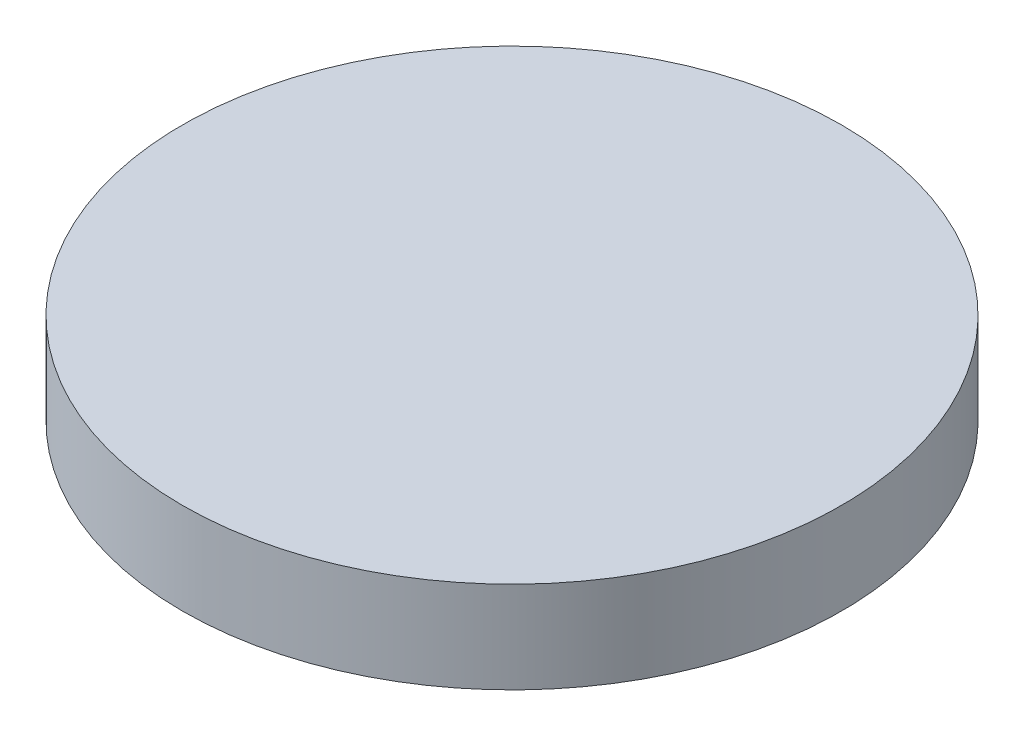
ISO-10303-21;
HEADER;
FILE_DESCRIPTION(('STEP AP214'),'2;1');
FILE_NAME('part.step','',(''),(''),'','','');
FILE_SCHEMA(('AUTOMOTIVE_DESIGN { 1 0 10303 214 1 1 1 1 }'));
ENDSEC;
DATA;
#1=APPLICATION_CONTEXT('core data for automotive mechanical design processes');
#2=APPLICATION_PROTOCOL_DEFINITION('international standard','automotive_design',2000,#1);
#3=PRODUCT_CONTEXT('',#1,'mechanical');
#4=PRODUCT('Part','Part','',(#3));
#5=PRODUCT_RELATED_PRODUCT_CATEGORY('part','',(#4));
#6=PRODUCT_DEFINITION_FORMATION('','',#4);
#7=PRODUCT_DEFINITION_CONTEXT('part definition',#1,'design');
#8=PRODUCT_DEFINITION('design','',#6,#7);
#9=PRODUCT_DEFINITION_SHAPE('','',#8);
#10=(LENGTH_UNIT() NAMED_UNIT(*) SI_UNIT(.MILLI.,.METRE.));
#11=(NAMED_UNIT(*) PLANE_ANGLE_UNIT() SI_UNIT($,.RADIAN.));
#12=(NAMED_UNIT(*) SI_UNIT($,.STERADIAN.) SOLID_ANGLE_UNIT());
#13=UNCERTAINTY_MEASURE_WITH_UNIT(LENGTH_MEASURE(1.E-05),#10,'distance_accuracy_value','');
#14=(GEOMETRIC_REPRESENTATION_CONTEXT(3) GLOBAL_UNCERTAINTY_ASSIGNED_CONTEXT((#13)) GLOBAL_UNIT_ASSIGNED_CONTEXT((#10,
#11,#12)) REPRESENTATION_CONTEXT('',''));
#15=CARTESIAN_POINT('',(0.,0.,0.));
#16=DIRECTION('',(0.,0.,1.));
#17=DIRECTION('',(1.,0.,0.));
#18=AXIS2_PLACEMENT_3D('',#15,#16,#17);
#19=CARTESIAN_POINT('',(4.99965588230111,3.175,4.96193611928675));
#20=DIRECTION('',(0.,-1.,0.));
#21=DIRECTION('',(0.,0.,-1.));
#22=AXIS2_PLACEMENT_3D('',#19,#20,#21);
#23=CYLINDRICAL_SURFACE('',#22,11.43);
#24=CARTESIAN_POINT('',(4.99965588230111,3.175,4.96193611928675));
#25=DIRECTION('',(0.,1.,0.));
#26=DIRECTION('',(0.,0.,1.));
#27=AXIS2_PLACEMENT_3D('',#24,#25,#26);
#28=CIRCLE('',#27,11.43);
#29=CARTESIAN_POINT('',(4.99965588230111,3.175,16.3919361192867));
#30=VERTEX_POINT('',#29);
#31=EDGE_CURVE('E10',#30,#30,#28,.T.);
#32=ORIENTED_EDGE('',*,*,#31,.F.);
#33=EDGE_LOOP('',(#32));
#34=FACE_BOUND('',#33,.T.);
#35=CARTESIAN_POINT('',(4.99965588230111,0.,4.96193611928675));
#36=DIRECTION('',(0.,1.,0.));
#37=DIRECTION('',(0.,0.,1.));
#38=AXIS2_PLACEMENT_3D('',#35,#36,#37);
#39=CIRCLE('',#38,11.43);
#40=CARTESIAN_POINT('',(4.99965588230111,0.,16.3919361192867));
#41=VERTEX_POINT('',#40);
#42=EDGE_CURVE('E36',#41,#41,#39,.T.);
#43=ORIENTED_EDGE('',*,*,#42,.T.);
#44=EDGE_LOOP('',(#43));
#45=FACE_BOUND('',#44,.T.);
#46=ADVANCED_FACE('F33',(#34,#45),#23,.T.);
#47=CARTESIAN_POINT('',(4.99965588230111,3.175,4.96193611928675));
#48=DIRECTION('',(0.,1.,0.));
#49=DIRECTION('',(0.,0.,1.));
#50=AXIS2_PLACEMENT_3D('',#47,#48,#49);
#51=PLANE('',#50);
#52=ORIENTED_EDGE('',*,*,#31,.T.);
#53=EDGE_LOOP('',(#52));
#54=FACE_BOUND('',#53,.T.);
#55=ADVANCED_FACE('F48',(#54),#51,.T.);
#56=CARTESIAN_POINT('',(4.99965588230111,0.,4.96193611928675));
#57=DIRECTION('',(0.,1.,0.));
#58=DIRECTION('',(0.,0.,1.));
#59=AXIS2_PLACEMENT_3D('',#56,#57,#58);
#60=PLANE('',#59);
#61=ORIENTED_EDGE('',*,*,#42,.F.);
#62=EDGE_LOOP('',(#61));
#63=FACE_BOUND('',#62,.T.);
#64=ADVANCED_FACE('F46',(#63),#60,.F.);
#65=CLOSED_SHELL('',(#46,#55,#64));
#66=MANIFOLD_SOLID_BREP('B2',#65);
#67=ADVANCED_BREP_SHAPE_REPRESENTATION('',(#18,#66),#14);
#68=SHAPE_DEFINITION_REPRESENTATION(#9,#67);
ENDSEC;
END-ISO-10303-21;
